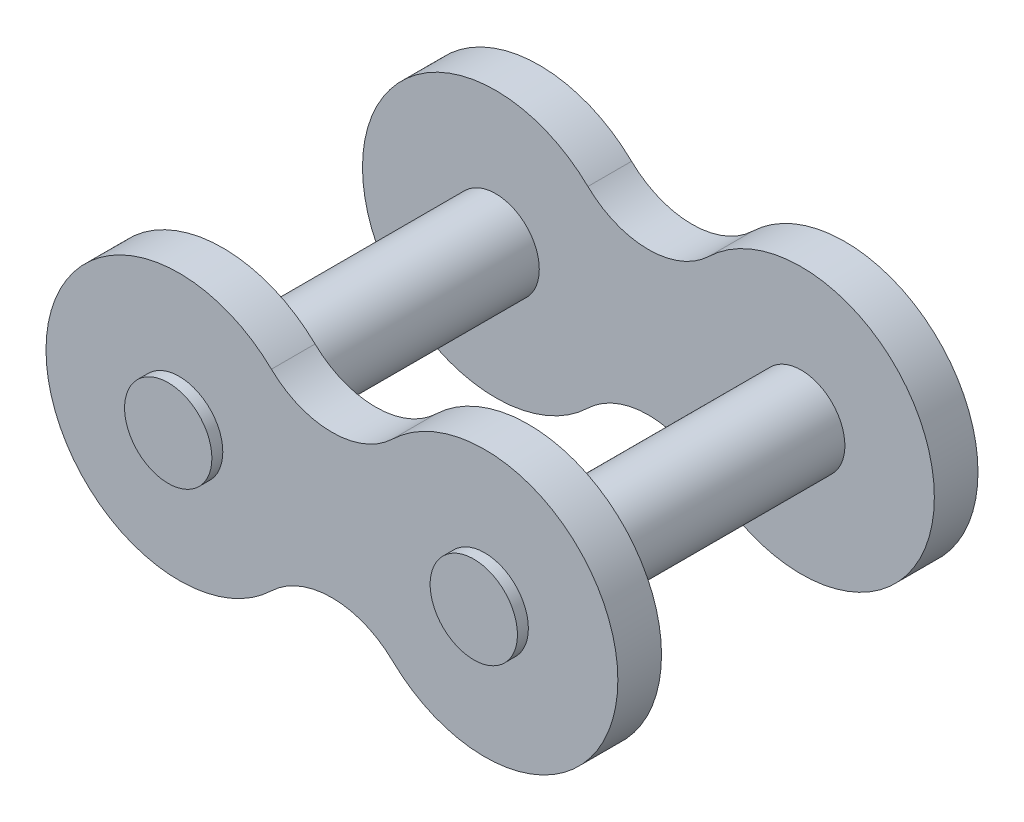
ISO-10303-21;
HEADER;
FILE_DESCRIPTION(('STEP AP214'),'2;1');
FILE_NAME('part.step','',(''),(''),'','','');
FILE_SCHEMA(('AUTOMOTIVE_DESIGN { 1 0 10303 214 1 1 1 1 }'));
ENDSEC;
DATA;
#1=APPLICATION_CONTEXT('core data for automotive mechanical design processes');
#2=APPLICATION_PROTOCOL_DEFINITION('international standard','automotive_design',2000,#1);
#3=PRODUCT_CONTEXT('',#1,'mechanical');
#4=PRODUCT('Part','Part','',(#3));
#5=PRODUCT_RELATED_PRODUCT_CATEGORY('part','',(#4));
#6=PRODUCT_DEFINITION_FORMATION('','',#4);
#7=PRODUCT_DEFINITION_CONTEXT('part definition',#1,'design');
#8=PRODUCT_DEFINITION('design','',#6,#7);
#9=PRODUCT_DEFINITION_SHAPE('','',#8);
#10=(LENGTH_UNIT() NAMED_UNIT(*) SI_UNIT(.MILLI.,.METRE.));
#11=(NAMED_UNIT(*) PLANE_ANGLE_UNIT() SI_UNIT($,.RADIAN.));
#12=(NAMED_UNIT(*) SI_UNIT($,.STERADIAN.) SOLID_ANGLE_UNIT());
#13=UNCERTAINTY_MEASURE_WITH_UNIT(LENGTH_MEASURE(1.E-05),#10,'distance_accuracy_value','');
#14=(GEOMETRIC_REPRESENTATION_CONTEXT(3) GLOBAL_UNCERTAINTY_ASSIGNED_CONTEXT((#13)) GLOBAL_UNIT_ASSIGNED_CONTEXT((#10,
#11,#12)) REPRESENTATION_CONTEXT('',''));
#15=CARTESIAN_POINT('',(0.,0.,0.));
#16=DIRECTION('',(0.,0.,1.));
#17=DIRECTION('',(1.,0.,0.));
#18=AXIS2_PLACEMENT_3D('',#15,#16,#17);
#19=CARTESIAN_POINT('',(3.5,3.64039832985348,2.));
#20=DIRECTION('',(0.,0.,1.));
#21=DIRECTION('',(1.,0.,0.));
#22=AXIS2_PLACEMENT_3D('',#19,#20,#21);
#23=PLANE('',#22);
#24=CARTESIAN_POINT('',(-7.,0.,2.));
#25=DIRECTION('',(0.,0.,1.));
#26=DIRECTION('',(1.,0.,0.));
#27=AXIS2_PLACEMENT_3D('',#24,#25,#26);
#28=CIRCLE('',#27,2.);
#29=CARTESIAN_POINT('',(-5.,0.,2.));
#30=VERTEX_POINT('',#29);
#31=EDGE_CURVE('E179',#30,#30,#28,.T.);
#32=ORIENTED_EDGE('',*,*,#31,.F.);
#33=EDGE_LOOP('',(#32));
#34=FACE_BOUND('',#33,.T.);
#35=CARTESIAN_POINT('',(0.,7.28079665970696,2.));
#36=DIRECTION('',(0.,0.,-1.));
#37=DIRECTION('',(1.,0.,0.));
#38=AXIS2_PLACEMENT_3D('',#35,#36,#37);
#39=CIRCLE('',#38,4.);
#40=CARTESIAN_POINT('',(2.77227722772277,4.39731283408044,2.));
#41=VERTEX_POINT('',#40);
#42=CARTESIAN_POINT('',(-2.77227722772277,4.39731283408044,2.));
#43=VERTEX_POINT('',#42);
#44=EDGE_CURVE('E185',#41,#43,#39,.T.);
#45=ORIENTED_EDGE('',*,*,#44,.T.);
#46=CARTESIAN_POINT('',(-7.,0.,2.));
#47=DIRECTION('',(0.,0.,1.));
#48=DIRECTION('',(1.,0.,0.));
#49=AXIS2_PLACEMENT_3D('',#46,#47,#48);
#50=CIRCLE('',#49,6.1);
#51=CARTESIAN_POINT('',(-2.77227722772277,-4.39731283408044,2.));
#52=VERTEX_POINT('',#51);
#53=EDGE_CURVE('E88',#43,#52,#50,.T.);
#54=ORIENTED_EDGE('',*,*,#53,.T.);
#55=CARTESIAN_POINT('',(0.,-7.28079665970696,2.));
#56=DIRECTION('',(0.,0.,-1.));
#57=DIRECTION('',(-1.,0.,0.));
#58=AXIS2_PLACEMENT_3D('',#55,#56,#57);
#59=CIRCLE('',#58,4.);
#60=CARTESIAN_POINT('',(2.77227722772277,-4.39731283408044,2.));
#61=VERTEX_POINT('',#60);
#62=EDGE_CURVE('E183',#52,#61,#59,.T.);
#63=ORIENTED_EDGE('',*,*,#62,.T.);
#64=CARTESIAN_POINT('',(7.,0.,2.));
#65=DIRECTION('',(0.,0.,1.));
#66=DIRECTION('',(-1.,0.,0.));
#67=AXIS2_PLACEMENT_3D('',#64,#65,#66);
#68=CIRCLE('',#67,6.1);
#69=EDGE_CURVE('E53',#61,#41,#68,.T.);
#70=ORIENTED_EDGE('',*,*,#69,.T.);
#71=EDGE_LOOP('',(#45,#54,#63,#70));
#72=FACE_BOUND('',#71,.T.);
#73=CARTESIAN_POINT('',(7.,0.,2.));
#74=DIRECTION('',(0.,0.,1.));
#75=DIRECTION('',(-1.,0.,0.));
#76=AXIS2_PLACEMENT_3D('',#73,#74,#75);
#77=CIRCLE('',#76,2.);
#78=CARTESIAN_POINT('',(5.,0.,2.));
#79=VERTEX_POINT('',#78);
#80=EDGE_CURVE('E173',#79,#79,#77,.T.);
#81=ORIENTED_EDGE('',*,*,#80,.F.);
#82=EDGE_LOOP('',(#81));
#83=FACE_BOUND('',#82,.T.);
#84=ADVANCED_FACE('F40',(#34,#72,#83),#23,.T.);
#85=CARTESIAN_POINT('',(3.5,3.64039832985348,0.));
#86=DIRECTION('',(0.,0.,1.));
#87=DIRECTION('',(1.,0.,0.));
#88=AXIS2_PLACEMENT_3D('',#85,#86,#87);
#89=PLANE('',#88);
#90=CARTESIAN_POINT('',(0.,7.28079665970696,0.));
#91=DIRECTION('',(0.,0.,-1.));
#92=DIRECTION('',(1.,0.,0.));
#93=AXIS2_PLACEMENT_3D('',#90,#91,#92);
#94=CIRCLE('',#93,4.);
#95=CARTESIAN_POINT('',(2.77227722772277,4.39731283408044,0.));
#96=VERTEX_POINT('',#95);
#97=CARTESIAN_POINT('',(-2.77227722772277,4.39731283408044,0.));
#98=VERTEX_POINT('',#97);
#99=EDGE_CURVE('E182',#96,#98,#94,.T.);
#100=ORIENTED_EDGE('',*,*,#99,.F.);
#101=CARTESIAN_POINT('',(7.,0.,0.));
#102=DIRECTION('',(0.,0.,1.));
#103=DIRECTION('',(-1.,0.,0.));
#104=AXIS2_PLACEMENT_3D('',#101,#102,#103);
#105=CIRCLE('',#104,6.1);
#106=CARTESIAN_POINT('',(2.77227722772277,-4.39731283408044,0.));
#107=VERTEX_POINT('',#106);
#108=EDGE_CURVE('E79',#107,#96,#105,.T.);
#109=ORIENTED_EDGE('',*,*,#108,.F.);
#110=CARTESIAN_POINT('',(0.,-7.28079665970696,0.));
#111=DIRECTION('',(0.,0.,-1.));
#112=DIRECTION('',(-1.,0.,0.));
#113=AXIS2_PLACEMENT_3D('',#110,#111,#112);
#114=CIRCLE('',#113,4.);
#115=CARTESIAN_POINT('',(-2.77227722772277,-4.39731283408044,0.));
#116=VERTEX_POINT('',#115);
#117=EDGE_CURVE('E75',#116,#107,#114,.T.);
#118=ORIENTED_EDGE('',*,*,#117,.F.);
#119=CARTESIAN_POINT('',(-7.,0.,0.));
#120=DIRECTION('',(0.,0.,1.));
#121=DIRECTION('',(1.,0.,0.));
#122=AXIS2_PLACEMENT_3D('',#119,#120,#121);
#123=CIRCLE('',#122,6.1);
#124=EDGE_CURVE('E192',#98,#116,#123,.T.);
#125=ORIENTED_EDGE('',*,*,#124,.F.);
#126=EDGE_LOOP('',(#100,#109,#118,#125));
#127=FACE_BOUND('',#126,.T.);
#128=CARTESIAN_POINT('',(-7.,0.,0.));
#129=DIRECTION('',(0.,0.,1.));
#130=DIRECTION('',(1.,0.,0.));
#131=AXIS2_PLACEMENT_3D('',#128,#129,#130);
#132=CIRCLE('',#131,2.);
#133=CARTESIAN_POINT('',(-5.,0.,0.));
#134=VERTEX_POINT('',#133);
#135=EDGE_CURVE('E175',#134,#134,#132,.T.);
#136=ORIENTED_EDGE('',*,*,#135,.T.);
#137=EDGE_LOOP('',(#136));
#138=FACE_BOUND('',#137,.T.);
#139=CARTESIAN_POINT('',(7.,0.,0.));
#140=DIRECTION('',(0.,0.,1.));
#141=DIRECTION('',(1.,0.,0.));
#142=AXIS2_PLACEMENT_3D('',#139,#140,#141);
#143=CIRCLE('',#142,2.);
#144=CARTESIAN_POINT('',(9.,0.,0.));
#145=VERTEX_POINT('',#144);
#146=EDGE_CURVE('E162',#145,#145,#143,.T.);
#147=ORIENTED_EDGE('',*,*,#146,.T.);
#148=EDGE_LOOP('',(#147));
#149=FACE_BOUND('',#148,.T.);
#150=ADVANCED_FACE('F214',(#127,#138,#149),#89,.F.);
#151=CARTESIAN_POINT('',(0.,7.28079665970696,2.));
#152=DIRECTION('',(0.,0.,-1.));
#153=DIRECTION('',(-1.,0.,0.));
#154=AXIS2_PLACEMENT_3D('',#151,#152,#153);
#155=CYLINDRICAL_SURFACE('',#154,4.);
#156=ORIENTED_EDGE('',*,*,#99,.T.);
#157=DIRECTION('',(0.,0.,-1.));
#158=VECTOR('',#157,1.);
#159=CARTESIAN_POINT('',(-2.77227722772277,4.39731283408044,2.));
#160=LINE('',#159,#158);
#161=EDGE_CURVE('E199',#43,#98,#160,.T.);
#162=ORIENTED_EDGE('',*,*,#161,.F.);
#163=ORIENTED_EDGE('',*,*,#44,.F.);
#164=DIRECTION('',(0.,0.,-1.));
#165=VECTOR('',#164,1.);
#166=CARTESIAN_POINT('',(2.77227722772277,4.39731283408044,2.));
#167=LINE('',#166,#165);
#168=EDGE_CURVE('E189',#41,#96,#167,.T.);
#169=ORIENTED_EDGE('',*,*,#168,.T.);
#170=EDGE_LOOP('',(#156,#162,#163,#169));
#171=FACE_BOUND('',#170,.T.);
#172=ADVANCED_FACE('F39',(#171),#155,.F.);
#173=CARTESIAN_POINT('',(-7.,0.,2.));
#174=DIRECTION('',(0.,0.,-1.));
#175=DIRECTION('',(-1.,0.,0.));
#176=AXIS2_PLACEMENT_3D('',#173,#174,#175);
#177=CYLINDRICAL_SURFACE('',#176,6.1);
#178=ORIENTED_EDGE('',*,*,#124,.T.);
#179=DIRECTION('',(0.,0.,-1.));
#180=VECTOR('',#179,1.);
#181=CARTESIAN_POINT('',(-2.77227722772277,-4.39731283408044,2.));
#182=LINE('',#181,#180);
#183=EDGE_CURVE('E196',#52,#116,#182,.T.);
#184=ORIENTED_EDGE('',*,*,#183,.F.);
#185=ORIENTED_EDGE('',*,*,#53,.F.);
#186=ORIENTED_EDGE('',*,*,#161,.T.);
#187=EDGE_LOOP('',(#178,#184,#185,#186));
#188=FACE_BOUND('',#187,.T.);
#189=ADVANCED_FACE('F231',(#188),#177,.T.);
#190=CARTESIAN_POINT('',(0.,-7.28079665970696,2.));
#191=DIRECTION('',(0.,0.,-1.));
#192=DIRECTION('',(-1.,0.,0.));
#193=AXIS2_PLACEMENT_3D('',#190,#191,#192);
#194=CYLINDRICAL_SURFACE('',#193,4.);
#195=ORIENTED_EDGE('',*,*,#117,.T.);
#196=DIRECTION('',(0.,0.,-1.));
#197=VECTOR('',#196,1.);
#198=CARTESIAN_POINT('',(2.77227722772277,-4.39731283408044,2.));
#199=LINE('',#198,#197);
#200=EDGE_CURVE('E198',#61,#107,#199,.T.);
#201=ORIENTED_EDGE('',*,*,#200,.F.);
#202=ORIENTED_EDGE('',*,*,#62,.F.);
#203=ORIENTED_EDGE('',*,*,#183,.T.);
#204=EDGE_LOOP('',(#195,#201,#202,#203));
#205=FACE_BOUND('',#204,.T.);
#206=ADVANCED_FACE('F235',(#205),#194,.F.);
#207=CARTESIAN_POINT('',(7.,0.,2.));
#208=DIRECTION('',(0.,0.,-1.));
#209=DIRECTION('',(-1.,0.,0.));
#210=AXIS2_PLACEMENT_3D('',#207,#208,#209);
#211=CYLINDRICAL_SURFACE('',#210,6.1);
#212=ORIENTED_EDGE('',*,*,#108,.T.);
#213=ORIENTED_EDGE('',*,*,#168,.F.);
#214=ORIENTED_EDGE('',*,*,#69,.F.);
#215=ORIENTED_EDGE('',*,*,#200,.T.);
#216=EDGE_LOOP('',(#212,#213,#214,#215));
#217=FACE_BOUND('',#216,.T.);
#218=ADVANCED_FACE('F229',(#217),#211,.T.);
#219=CARTESIAN_POINT('',(-7.,0.,-0.5));
#220=DIRECTION('',(0.,0.,1.));
#221=DIRECTION('',(1.,0.,0.));
#222=AXIS2_PLACEMENT_3D('',#219,#220,#221);
#223=PLANE('',#222);
#224=CARTESIAN_POINT('',(-7.,0.,-0.5));
#225=DIRECTION('',(0.,0.,1.));
#226=DIRECTION('',(1.,0.,0.));
#227=AXIS2_PLACEMENT_3D('',#224,#225,#226);
#228=CIRCLE('',#227,2.);
#229=CARTESIAN_POINT('',(-5.,0.,-0.5));
#230=VERTEX_POINT('',#229);
#231=EDGE_CURVE('E166',#230,#230,#228,.T.);
#232=ORIENTED_EDGE('',*,*,#231,.F.);
#233=EDGE_LOOP('',(#232));
#234=FACE_BOUND('',#233,.T.);
#235=ADVANCED_FACE('F232',(#234),#223,.F.);
#236=CARTESIAN_POINT('',(-7.,0.,-0.5));
#237=DIRECTION('',(0.,0.,1.));
#238=DIRECTION('',(1.,0.,0.));
#239=AXIS2_PLACEMENT_3D('',#236,#237,#238);
#240=CYLINDRICAL_SURFACE('',#239,2.);
#241=ORIENTED_EDGE('',*,*,#231,.T.);
#242=EDGE_LOOP('',(#241));
#243=FACE_BOUND('',#242,.T.);
#244=ORIENTED_EDGE('',*,*,#135,.F.);
#245=EDGE_LOOP('',(#244));
#246=FACE_BOUND('',#245,.T.);
#247=ADVANCED_FACE('F329',(#243,#246),#240,.T.);
#248=CARTESIAN_POINT('',(-7.,0.,14.5));
#249=DIRECTION('',(0.,0.,-1.));
#250=DIRECTION('',(-1.,0.,0.));
#251=AXIS2_PLACEMENT_3D('',#248,#249,#250);
#252=CIRCLE('',#251,2.);
#253=CARTESIAN_POINT('',(-9.,0.,14.5));
#254=VERTEX_POINT('',#253);
#255=EDGE_CURVE('E11',#254,#254,#252,.F.);
#256=ORIENTED_EDGE('',*,*,#255,.F.);
#257=EDGE_LOOP('',(#256));
#258=FACE_BOUND('',#257,.T.);
#259=ORIENTED_EDGE('',*,*,#31,.T.);
#260=EDGE_LOOP('',(#259));
#261=FACE_BOUND('',#260,.T.);
#262=ADVANCED_FACE('F223',(#258,#261),#240,.T.);
#263=CARTESIAN_POINT('',(7.,0.,-0.5));
#264=DIRECTION('',(0.,0.,1.));
#265=DIRECTION('',(1.,0.,0.));
#266=AXIS2_PLACEMENT_3D('',#263,#264,#265);
#267=PLANE('',#266);
#268=CARTESIAN_POINT('',(7.,0.,-0.5));
#269=DIRECTION('',(0.,0.,1.));
#270=DIRECTION('',(1.,0.,0.));
#271=AXIS2_PLACEMENT_3D('',#268,#269,#270);
#272=CIRCLE('',#271,2.);
#273=CARTESIAN_POINT('',(9.,0.,-0.5));
#274=VERTEX_POINT('',#273);
#275=EDGE_CURVE('E159',#274,#274,#272,.T.);
#276=ORIENTED_EDGE('',*,*,#275,.F.);
#277=EDGE_LOOP('',(#276));
#278=FACE_BOUND('',#277,.T.);
#279=ADVANCED_FACE('F248',(#278),#267,.F.);
#280=CARTESIAN_POINT('',(7.,0.,-0.5));
#281=DIRECTION('',(0.,0.,1.));
#282=DIRECTION('',(1.,0.,0.));
#283=AXIS2_PLACEMENT_3D('',#280,#281,#282);
#284=CYLINDRICAL_SURFACE('',#283,2.);
#285=ORIENTED_EDGE('',*,*,#275,.T.);
#286=EDGE_LOOP('',(#285));
#287=FACE_BOUND('',#286,.T.);
#288=ORIENTED_EDGE('',*,*,#146,.F.);
#289=EDGE_LOOP('',(#288));
#290=FACE_BOUND('',#289,.T.);
#291=ADVANCED_FACE('F207',(#287,#290),#284,.T.);
#292=CARTESIAN_POINT('',(7.,0.,14.5));
#293=DIRECTION('',(0.,0.,-1.));
#294=DIRECTION('',(-1.,0.,0.));
#295=AXIS2_PLACEMENT_3D('',#292,#293,#294);
#296=CIRCLE('',#295,2.);
#297=CARTESIAN_POINT('',(5.,0.,14.5));
#298=VERTEX_POINT('',#297);
#299=EDGE_CURVE('E46',#298,#298,#296,.F.);
#300=ORIENTED_EDGE('',*,*,#299,.F.);
#301=EDGE_LOOP('',(#300));
#302=FACE_BOUND('',#301,.T.);
#303=ORIENTED_EDGE('',*,*,#80,.T.);
#304=EDGE_LOOP('',(#303));
#305=FACE_BOUND('',#304,.T.);
#306=ADVANCED_FACE('F206',(#302,#305),#284,.T.);
#307=CARTESIAN_POINT('',(0.,7.28079665970696,14.5));
#308=DIRECTION('',(0.,0.,1.));
#309=DIRECTION('',(1.,0.,0.));
#310=AXIS2_PLACEMENT_3D('',#307,#308,#309);
#311=CYLINDRICAL_SURFACE('',#310,4.);
#312=CARTESIAN_POINT('',(0.,7.28079665970696,16.5));
#313=DIRECTION('',(0.,0.,-1.));
#314=DIRECTION('',(1.,0.,0.));
#315=AXIS2_PLACEMENT_3D('',#312,#313,#314);
#316=CIRCLE('',#315,4.);
#317=CARTESIAN_POINT('',(2.77227722772277,4.39731283408044,16.5));
#318=VERTEX_POINT('',#317);
#319=CARTESIAN_POINT('',(-2.77227722772277,4.39731283408044,16.5));
#320=VERTEX_POINT('',#319);
#321=EDGE_CURVE('E116',#318,#320,#316,.T.);
#322=ORIENTED_EDGE('',*,*,#321,.F.);
#323=DIRECTION('',(0.,0.,1.));
#324=VECTOR('',#323,1.);
#325=CARTESIAN_POINT('',(2.77227722772277,4.39731283408044,14.5));
#326=LINE('',#325,#324);
#327=CARTESIAN_POINT('',(2.77227722772277,4.39731283408044,14.5));
#328=VERTEX_POINT('',#327);
#329=EDGE_CURVE('E114',#328,#318,#326,.T.);
#330=ORIENTED_EDGE('',*,*,#329,.F.);
#331=CARTESIAN_POINT('',(0.,7.28079665970696,14.5));
#332=DIRECTION('',(0.,0.,-1.));
#333=DIRECTION('',(1.,0.,0.));
#334=AXIS2_PLACEMENT_3D('',#331,#332,#333);
#335=CIRCLE('',#334,4.);
#336=CARTESIAN_POINT('',(-2.77227722772277,4.39731283408044,14.5));
#337=VERTEX_POINT('',#336);
#338=EDGE_CURVE('E117',#328,#337,#335,.T.);
#339=ORIENTED_EDGE('',*,*,#338,.T.);
#340=DIRECTION('',(0.,0.,1.));
#341=VECTOR('',#340,1.);
#342=CARTESIAN_POINT('',(-2.77227722772277,4.39731283408044,14.5));
#343=LINE('',#342,#341);
#344=EDGE_CURVE('E145',#337,#320,#343,.T.);
#345=ORIENTED_EDGE('',*,*,#344,.T.);
#346=EDGE_LOOP('',(#322,#330,#339,#345));
#347=FACE_BOUND('',#346,.T.);
#348=ADVANCED_FACE('F113',(#347),#311,.F.);
#349=CARTESIAN_POINT('',(7.,0.,14.5));
#350=DIRECTION('',(0.,0.,1.));
#351=DIRECTION('',(1.,0.,0.));
#352=AXIS2_PLACEMENT_3D('',#349,#350,#351);
#353=CYLINDRICAL_SURFACE('',#352,6.1);
#354=CARTESIAN_POINT('',(7.,0.,16.5));
#355=DIRECTION('',(0.,0.,1.));
#356=DIRECTION('',(-1.,0.,0.));
#357=AXIS2_PLACEMENT_3D('',#354,#355,#356);
#358=CIRCLE('',#357,6.1);
#359=CARTESIAN_POINT('',(2.77227722772277,-4.39731283408044,16.5));
#360=VERTEX_POINT('',#359);
#361=EDGE_CURVE('E148',#360,#318,#358,.T.);
#362=ORIENTED_EDGE('',*,*,#361,.F.);
#363=DIRECTION('',(0.,0.,1.));
#364=VECTOR('',#363,1.);
#365=CARTESIAN_POINT('',(2.77227722772277,-4.39731283408044,14.5));
#366=LINE('',#365,#364);
#367=CARTESIAN_POINT('',(2.77227722772277,-4.39731283408044,14.5));
#368=VERTEX_POINT('',#367);
#369=EDGE_CURVE('E123',#368,#360,#366,.T.);
#370=ORIENTED_EDGE('',*,*,#369,.F.);
#371=CARTESIAN_POINT('',(7.,0.,14.5));
#372=DIRECTION('',(0.,0.,1.));
#373=DIRECTION('',(-1.,0.,0.));
#374=AXIS2_PLACEMENT_3D('',#371,#372,#373);
#375=CIRCLE('',#374,6.1);
#376=EDGE_CURVE('E132',#368,#328,#375,.T.);
#377=ORIENTED_EDGE('',*,*,#376,.T.);
#378=ORIENTED_EDGE('',*,*,#329,.T.);
#379=EDGE_LOOP('',(#362,#370,#377,#378));
#380=FACE_BOUND('',#379,.T.);
#381=ADVANCED_FACE('F140',(#380),#353,.T.);
#382=CARTESIAN_POINT('',(0.,-7.28079665970696,14.5));
#383=DIRECTION('',(0.,0.,1.));
#384=DIRECTION('',(1.,0.,0.));
#385=AXIS2_PLACEMENT_3D('',#382,#383,#384);
#386=CYLINDRICAL_SURFACE('',#385,4.);
#387=CARTESIAN_POINT('',(0.,-7.28079665970696,16.5));
#388=DIRECTION('',(0.,0.,-1.));
#389=DIRECTION('',(-1.,0.,0.));
#390=AXIS2_PLACEMENT_3D('',#387,#388,#389);
#391=CIRCLE('',#390,4.);
#392=CARTESIAN_POINT('',(-2.77227722772277,-4.39731283408044,16.5));
#393=VERTEX_POINT('',#392);
#394=EDGE_CURVE('E149',#393,#360,#391,.T.);
#395=ORIENTED_EDGE('',*,*,#394,.F.);
#396=DIRECTION('',(0.,0.,1.));
#397=VECTOR('',#396,1.);
#398=CARTESIAN_POINT('',(-2.77227722772277,-4.39731283408044,14.5));
#399=LINE('',#398,#397);
#400=CARTESIAN_POINT('',(-2.77227722772277,-4.39731283408044,14.5));
#401=VERTEX_POINT('',#400);
#402=EDGE_CURVE('E154',#401,#393,#399,.T.);
#403=ORIENTED_EDGE('',*,*,#402,.F.);
#404=CARTESIAN_POINT('',(0.,-7.28079665970696,14.5));
#405=DIRECTION('',(0.,0.,-1.));
#406=DIRECTION('',(-1.,0.,0.));
#407=AXIS2_PLACEMENT_3D('',#404,#405,#406);
#408=CIRCLE('',#407,4.);
#409=EDGE_CURVE('E139',#401,#368,#408,.T.);
#410=ORIENTED_EDGE('',*,*,#409,.T.);
#411=ORIENTED_EDGE('',*,*,#369,.T.);
#412=EDGE_LOOP('',(#395,#403,#410,#411));
#413=FACE_BOUND('',#412,.T.);
#414=ADVANCED_FACE('F286',(#413),#386,.F.);
#415=CARTESIAN_POINT('',(-7.,0.,14.5));
#416=DIRECTION('',(0.,0.,1.));
#417=DIRECTION('',(1.,0.,0.));
#418=AXIS2_PLACEMENT_3D('',#415,#416,#417);
#419=CYLINDRICAL_SURFACE('',#418,6.1);
#420=CARTESIAN_POINT('',(-7.,0.,16.5));
#421=DIRECTION('',(0.,0.,1.));
#422=DIRECTION('',(1.,0.,0.));
#423=AXIS2_PLACEMENT_3D('',#420,#421,#422);
#424=CIRCLE('',#423,6.1);
#425=EDGE_CURVE('E133',#320,#393,#424,.T.);
#426=ORIENTED_EDGE('',*,*,#425,.F.);
#427=ORIENTED_EDGE('',*,*,#344,.F.);
#428=CARTESIAN_POINT('',(-7.,0.,14.5));
#429=DIRECTION('',(0.,0.,1.));
#430=DIRECTION('',(1.,0.,0.));
#431=AXIS2_PLACEMENT_3D('',#428,#429,#430);
#432=CIRCLE('',#431,6.1);
#433=EDGE_CURVE('E131',#337,#401,#432,.T.);
#434=ORIENTED_EDGE('',*,*,#433,.T.);
#435=ORIENTED_EDGE('',*,*,#402,.T.);
#436=EDGE_LOOP('',(#426,#427,#434,#435));
#437=FACE_BOUND('',#436,.T.);
#438=ADVANCED_FACE('F287',(#437),#419,.T.);
#439=CARTESIAN_POINT('',(3.5,3.64039832985348,14.5));
#440=DIRECTION('',(0.,0.,-1.));
#441=DIRECTION('',(1.,0.,0.));
#442=AXIS2_PLACEMENT_3D('',#439,#440,#441);
#443=PLANE('',#442);
#444=ORIENTED_EDGE('',*,*,#299,.T.);
#445=EDGE_LOOP('',(#444));
#446=FACE_BOUND('',#445,.T.);
#447=ORIENTED_EDGE('',*,*,#255,.T.);
#448=EDGE_LOOP('',(#447));
#449=FACE_BOUND('',#448,.T.);
#450=ORIENTED_EDGE('',*,*,#338,.F.);
#451=ORIENTED_EDGE('',*,*,#376,.F.);
#452=ORIENTED_EDGE('',*,*,#409,.F.);
#453=ORIENTED_EDGE('',*,*,#433,.F.);
#454=EDGE_LOOP('',(#450,#451,#452,#453));
#455=FACE_BOUND('',#454,.T.);
#456=ADVANCED_FACE('F129',(#446,#449,#455),#443,.T.);
#457=CARTESIAN_POINT('',(3.5,3.64039832985348,16.5));
#458=DIRECTION('',(0.,0.,-1.));
#459=DIRECTION('',(1.,0.,0.));
#460=AXIS2_PLACEMENT_3D('',#457,#458,#459);
#461=PLANE('',#460);
#462=CARTESIAN_POINT('',(7.,0.,16.5));
#463=DIRECTION('',(0.,0.,1.));
#464=DIRECTION('',(-1.,0.,0.));
#465=AXIS2_PLACEMENT_3D('',#462,#463,#464);
#466=CIRCLE('',#465,2.);
#467=CARTESIAN_POINT('',(5.,0.,16.5));
#468=VERTEX_POINT('',#467);
#469=EDGE_CURVE('E275',#468,#468,#466,.T.);
#470=ORIENTED_EDGE('',*,*,#469,.F.);
#471=EDGE_LOOP('',(#470));
#472=FACE_BOUND('',#471,.T.);
#473=CARTESIAN_POINT('',(-7.,0.,16.5));
#474=DIRECTION('',(0.,0.,1.));
#475=DIRECTION('',(1.,0.,0.));
#476=AXIS2_PLACEMENT_3D('',#473,#474,#475);
#477=CIRCLE('',#476,2.);
#478=CARTESIAN_POINT('',(-5.,0.,16.5));
#479=VERTEX_POINT('',#478);
#480=EDGE_CURVE('E150',#479,#479,#477,.T.);
#481=ORIENTED_EDGE('',*,*,#480,.F.);
#482=EDGE_LOOP('',(#481));
#483=FACE_BOUND('',#482,.T.);
#484=ORIENTED_EDGE('',*,*,#321,.T.);
#485=ORIENTED_EDGE('',*,*,#425,.T.);
#486=ORIENTED_EDGE('',*,*,#394,.T.);
#487=ORIENTED_EDGE('',*,*,#361,.T.);
#488=EDGE_LOOP('',(#484,#485,#486,#487));
#489=FACE_BOUND('',#488,.T.);
#490=ADVANCED_FACE('F276',(#472,#483,#489),#461,.F.);
#491=CARTESIAN_POINT('',(-7.,0.,17.));
#492=DIRECTION('',(0.,0.,1.));
#493=DIRECTION('',(1.,0.,0.));
#494=AXIS2_PLACEMENT_3D('',#491,#492,#493);
#495=PLANE('',#494);
#496=CARTESIAN_POINT('',(-7.,0.,17.));
#497=DIRECTION('',(0.,0.,1.));
#498=DIRECTION('',(1.,0.,0.));
#499=AXIS2_PLACEMENT_3D('',#496,#497,#498);
#500=CIRCLE('',#499,2.);
#501=CARTESIAN_POINT('',(-5.,0.,17.));
#502=VERTEX_POINT('',#501);
#503=EDGE_CURVE('E167',#502,#502,#500,.T.);
#504=ORIENTED_EDGE('',*,*,#503,.T.);
#505=EDGE_LOOP('',(#504));
#506=FACE_BOUND('',#505,.T.);
#507=ADVANCED_FACE('F285',(#506),#495,.T.);
#508=ORIENTED_EDGE('',*,*,#503,.F.);
#509=EDGE_LOOP('',(#508));
#510=FACE_BOUND('',#509,.T.);
#511=ORIENTED_EDGE('',*,*,#480,.T.);
#512=EDGE_LOOP('',(#511));
#513=FACE_BOUND('',#512,.T.);
#514=ADVANCED_FACE('F264',(#510,#513),#240,.T.);
#515=CARTESIAN_POINT('',(7.,0.,17.));
#516=DIRECTION('',(0.,0.,1.));
#517=DIRECTION('',(1.,0.,0.));
#518=AXIS2_PLACEMENT_3D('',#515,#516,#517);
#519=PLANE('',#518);
#520=CARTESIAN_POINT('',(7.,0.,17.));
#521=DIRECTION('',(0.,0.,1.));
#522=DIRECTION('',(1.,0.,0.));
#523=AXIS2_PLACEMENT_3D('',#520,#521,#522);
#524=CIRCLE('',#523,2.);
#525=CARTESIAN_POINT('',(9.,0.,17.));
#526=VERTEX_POINT('',#525);
#527=EDGE_CURVE('E121',#526,#526,#524,.T.);
#528=ORIENTED_EDGE('',*,*,#527,.T.);
#529=EDGE_LOOP('',(#528));
#530=FACE_BOUND('',#529,.T.);
#531=ADVANCED_FACE('F257',(#530),#519,.T.);
#532=ORIENTED_EDGE('',*,*,#527,.F.);
#533=EDGE_LOOP('',(#532));
#534=FACE_BOUND('',#533,.T.);
#535=ORIENTED_EDGE('',*,*,#469,.T.);
#536=EDGE_LOOP('',(#535));
#537=FACE_BOUND('',#536,.T.);
#538=ADVANCED_FACE('F211',(#534,#537),#284,.T.);
#539=CLOSED_SHELL('',(#84,#150,#172,#189,#206,#218,#235,#247,#262,#279,#291,#306,#348,#381,#414,
#438,#456,#490,#507,#514,#531,#538));
#540=MANIFOLD_SOLID_BREP('B2',#539);
#541=ADVANCED_BREP_SHAPE_REPRESENTATION('',(#18,#540),#14);
#542=SHAPE_DEFINITION_REPRESENTATION(#9,#541);
ENDSEC;
END-ISO-10303-21;
